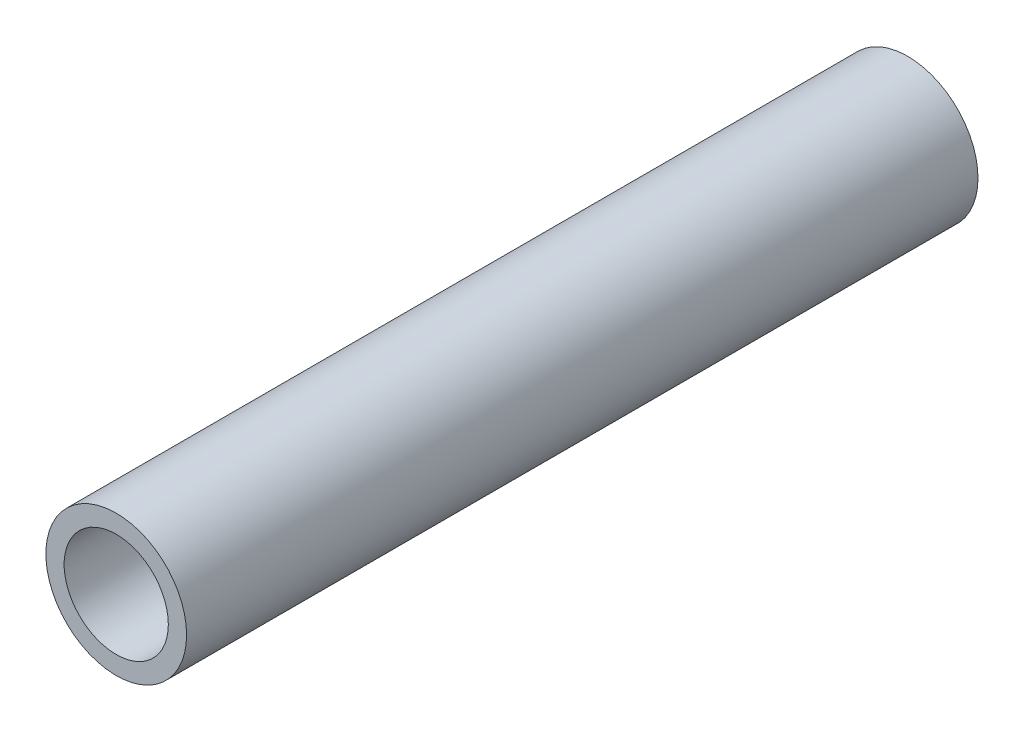
ISO-10303-21;
HEADER;
FILE_DESCRIPTION(('STEP AP214'),'2;1');
FILE_NAME('part.step','',(''),(''),'','','');
FILE_SCHEMA(('AUTOMOTIVE_DESIGN { 1 0 10303 214 1 1 1 1 }'));
ENDSEC;
DATA;
#1=APPLICATION_CONTEXT('core data for automotive mechanical design processes');
#2=APPLICATION_PROTOCOL_DEFINITION('international standard','automotive_design',2000,#1);
#3=PRODUCT_CONTEXT('',#1,'mechanical');
#4=PRODUCT('Part','Part','',(#3));
#5=PRODUCT_RELATED_PRODUCT_CATEGORY('part','',(#4));
#6=PRODUCT_DEFINITION_FORMATION('','',#4);
#7=PRODUCT_DEFINITION_CONTEXT('part definition',#1,'design');
#8=PRODUCT_DEFINITION('design','',#6,#7);
#9=PRODUCT_DEFINITION_SHAPE('','',#8);
#10=(LENGTH_UNIT() NAMED_UNIT(*) SI_UNIT(.MILLI.,.METRE.));
#11=(NAMED_UNIT(*) PLANE_ANGLE_UNIT() SI_UNIT($,.RADIAN.));
#12=(NAMED_UNIT(*) SI_UNIT($,.STERADIAN.) SOLID_ANGLE_UNIT());
#13=UNCERTAINTY_MEASURE_WITH_UNIT(LENGTH_MEASURE(1.E-05),#10,'distance_accuracy_value','');
#14=(GEOMETRIC_REPRESENTATION_CONTEXT(3) GLOBAL_UNCERTAINTY_ASSIGNED_CONTEXT((#13)) GLOBAL_UNIT_ASSIGNED_CONTEXT((#10,
#11,#12)) REPRESENTATION_CONTEXT('',''));
#15=CARTESIAN_POINT('',(0.,0.,0.));
#16=DIRECTION('',(0.,0.,1.));
#17=DIRECTION('',(1.,0.,0.));
#18=AXIS2_PLACEMENT_3D('',#15,#16,#17);
#19=CARTESIAN_POINT('',(0.,0.,60.));
#20=DIRECTION('',(0.,0.,1.));
#21=DIRECTION('',(1.,0.,0.));
#22=AXIS2_PLACEMENT_3D('',#19,#20,#21);
#23=PLANE('',#22);
#24=CARTESIAN_POINT('',(0.,0.,60.));
#25=DIRECTION('',(0.,0.,1.));
#26=DIRECTION('',(1.,0.,0.));
#27=AXIS2_PLACEMENT_3D('',#24,#25,#26);
#28=CIRCLE('',#27,10.668);
#29=CARTESIAN_POINT('',(10.668,0.,60.));
#30=VERTEX_POINT('',#29);
#31=EDGE_CURVE('E11',#30,#30,#28,.T.);
#32=ORIENTED_EDGE('',*,*,#31,.T.);
#33=EDGE_LOOP('',(#32));
#34=FACE_BOUND('',#33,.T.);
#35=CARTESIAN_POINT('',(0.,0.,60.));
#36=DIRECTION('',(0.,0.,1.));
#37=DIRECTION('',(1.,0.,0.));
#38=AXIS2_PLACEMENT_3D('',#35,#36,#37);
#39=CIRCLE('',#38,7.8994);
#40=CARTESIAN_POINT('',(7.8994,0.,60.));
#41=VERTEX_POINT('',#40);
#42=EDGE_CURVE('E56',#41,#41,#39,.T.);
#43=ORIENTED_EDGE('',*,*,#42,.F.);
#44=EDGE_LOOP('',(#43));
#45=FACE_BOUND('',#44,.T.);
#46=ADVANCED_FACE('F43',(#34,#45),#23,.T.);
#47=CARTESIAN_POINT('',(0.,0.,-60.));
#48=DIRECTION('',(0.,0.,1.));
#49=DIRECTION('',(1.,0.,0.));
#50=AXIS2_PLACEMENT_3D('',#47,#48,#49);
#51=PLANE('',#50);
#52=CARTESIAN_POINT('',(0.,0.,-60.));
#53=DIRECTION('',(0.,0.,1.));
#54=DIRECTION('',(1.,0.,0.));
#55=AXIS2_PLACEMENT_3D('',#52,#53,#54);
#56=CIRCLE('',#55,10.668);
#57=CARTESIAN_POINT('',(10.668,0.,-60.));
#58=VERTEX_POINT('',#57);
#59=EDGE_CURVE('E47',#58,#58,#56,.T.);
#60=ORIENTED_EDGE('',*,*,#59,.F.);
#61=EDGE_LOOP('',(#60));
#62=FACE_BOUND('',#61,.T.);
#63=CARTESIAN_POINT('',(0.,0.,-60.));
#64=DIRECTION('',(0.,0.,1.));
#65=DIRECTION('',(1.,0.,0.));
#66=AXIS2_PLACEMENT_3D('',#63,#64,#65);
#67=CIRCLE('',#66,7.8994);
#68=CARTESIAN_POINT('',(7.8994,0.,-60.));
#69=VERTEX_POINT('',#68);
#70=EDGE_CURVE('E58',#69,#69,#67,.T.);
#71=ORIENTED_EDGE('',*,*,#70,.T.);
#72=EDGE_LOOP('',(#71));
#73=FACE_BOUND('',#72,.T.);
#74=ADVANCED_FACE('F70',(#62,#73),#51,.F.);
#75=CARTESIAN_POINT('',(0.,0.,60.));
#76=DIRECTION('',(0.,0.,-1.));
#77=DIRECTION('',(-1.,0.,0.));
#78=AXIS2_PLACEMENT_3D('',#75,#76,#77);
#79=CYLINDRICAL_SURFACE('',#78,10.668);
#80=ORIENTED_EDGE('',*,*,#31,.F.);
#81=EDGE_LOOP('',(#80));
#82=FACE_BOUND('',#81,.T.);
#83=ORIENTED_EDGE('',*,*,#59,.T.);
#84=EDGE_LOOP('',(#83));
#85=FACE_BOUND('',#84,.T.);
#86=ADVANCED_FACE('F45',(#82,#85),#79,.T.);
#87=CARTESIAN_POINT('',(0.,0.,60.));
#88=DIRECTION('',(0.,0.,-1.));
#89=DIRECTION('',(-1.,0.,0.));
#90=AXIS2_PLACEMENT_3D('',#87,#88,#89);
#91=CYLINDRICAL_SURFACE('',#90,7.8994);
#92=ORIENTED_EDGE('',*,*,#42,.T.);
#93=EDGE_LOOP('',(#92));
#94=FACE_BOUND('',#93,.T.);
#95=ORIENTED_EDGE('',*,*,#70,.F.);
#96=EDGE_LOOP('',(#95));
#97=FACE_BOUND('',#96,.T.);
#98=ADVANCED_FACE('F66',(#94,#97),#91,.F.);
#99=CLOSED_SHELL('',(#46,#74,#86,#98));
#100=MANIFOLD_SOLID_BREP('B2',#99);
#101=ADVANCED_BREP_SHAPE_REPRESENTATION('',(#18,#100),#14);
#102=SHAPE_DEFINITION_REPRESENTATION(#9,#101);
ENDSEC;
END-ISO-10303-21;
